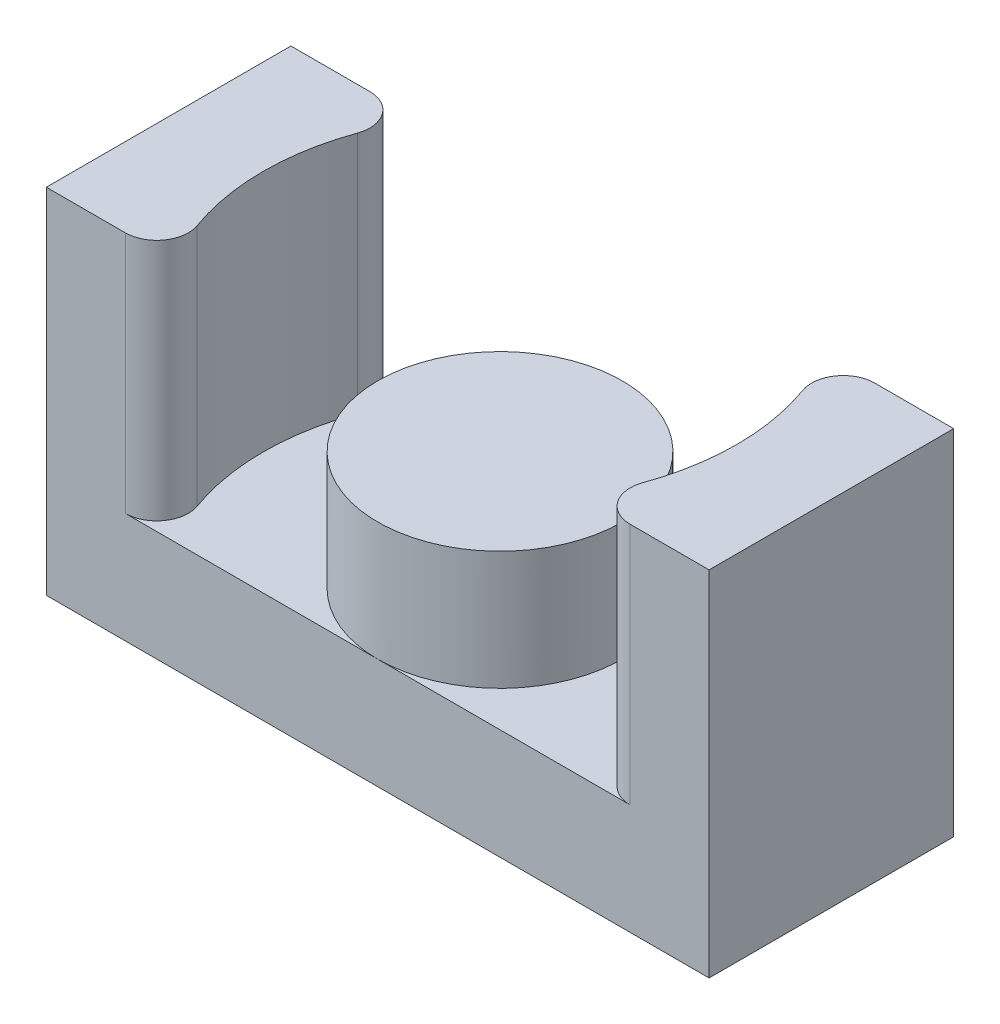
ISO-10303-21;
HEADER;
FILE_DESCRIPTION(('STEP AP214'),'2;1');
FILE_NAME('part.step','',(''),(''),'','','');
FILE_SCHEMA(('AUTOMOTIVE_DESIGN { 1 0 10303 214 1 1 1 1 }'));
ENDSEC;
DATA;
#1=APPLICATION_CONTEXT('core data for automotive mechanical design processes');
#2=APPLICATION_PROTOCOL_DEFINITION('international standard','automotive_design',2000,#1);
#3=PRODUCT_CONTEXT('',#1,'mechanical');
#4=PRODUCT('Part','Part','',(#3));
#5=PRODUCT_RELATED_PRODUCT_CATEGORY('part','',(#4));
#6=PRODUCT_DEFINITION_FORMATION('','',#4);
#7=PRODUCT_DEFINITION_CONTEXT('part definition',#1,'design');
#8=PRODUCT_DEFINITION('design','',#6,#7);
#9=PRODUCT_DEFINITION_SHAPE('','',#8);
#10=(LENGTH_UNIT() NAMED_UNIT(*) SI_UNIT(.MILLI.,.METRE.));
#11=(NAMED_UNIT(*) PLANE_ANGLE_UNIT() SI_UNIT($,.RADIAN.));
#12=(NAMED_UNIT(*) SI_UNIT($,.STERADIAN.) SOLID_ANGLE_UNIT());
#13=UNCERTAINTY_MEASURE_WITH_UNIT(LENGTH_MEASURE(1.E-05),#10,'distance_accuracy_value','');
#14=(GEOMETRIC_REPRESENTATION_CONTEXT(3) GLOBAL_UNCERTAINTY_ASSIGNED_CONTEXT((#13)) GLOBAL_UNIT_ASSIGNED_CONTEXT((#10,
#11,#12)) REPRESENTATION_CONTEXT('',''));
#15=CARTESIAN_POINT('',(0.,0.,0.));
#16=DIRECTION('',(0.,0.,1.));
#17=DIRECTION('',(1.,0.,0.));
#18=AXIS2_PLACEMENT_3D('',#15,#16,#17);
#19=CARTESIAN_POINT('',(0.,14.525,0.));
#20=DIRECTION('',(0.,1.,0.));
#21=DIRECTION('',(-1.,0.,0.));
#22=AXIS2_PLACEMENT_3D('',#19,#20,#21);
#23=PLANE('',#22);
#24=CARTESIAN_POINT('',(0.,14.525,0.));
#25=DIRECTION('',(0.,1.,0.));
#26=DIRECTION('',(-1.,0.,0.));
#27=AXIS2_PLACEMENT_3D('',#24,#25,#26);
#28=CIRCLE('',#27,7.75);
#29=CARTESIAN_POINT('',(-7.75,14.525,0.));
#30=VERTEX_POINT('',#29);
#31=EDGE_CURVE('E20',#30,#30,#28,.F.);
#32=ORIENTED_EDGE('',*,*,#31,.F.);
#33=EDGE_LOOP('',(#32));
#34=FACE_BOUND('',#33,.T.);
#35=ADVANCED_FACE('F17',(#34),#23,.T.);
#36=CARTESIAN_POINT('',(0.,7.,0.));
#37=DIRECTION('',(0.,1.,0.));
#38=DIRECTION('',(-1.,0.,0.));
#39=AXIS2_PLACEMENT_3D('',#36,#37,#38);
#40=CYLINDRICAL_SURFACE('',#39,15.);
#41=DIRECTION('',(0.,1.,0.));
#42=VECTOR('',#41,1.);
#43=CARTESIAN_POINT('',(-14.1159236080378,6.99999999999997,5.0735294117647));
#44=LINE('',#43,#42);
#45=CARTESIAN_POINT('',(-14.1159236080378,6.99999999999998,5.0735294117647));
#46=VERTEX_POINT('',#45);
#47=CARTESIAN_POINT('',(-14.1159236080378,22.4,5.0735294117647));
#48=VERTEX_POINT('',#47);
#49=EDGE_CURVE('E113',#46,#48,#44,.T.);
#50=ORIENTED_EDGE('',*,*,#49,.F.);
#51=CARTESIAN_POINT('',(0.,6.99999999999998,0.));
#52=DIRECTION('',(0.,1.,0.));
#53=DIRECTION('',(-1.,0.,0.));
#54=AXIS2_PLACEMENT_3D('',#51,#52,#53);
#55=CIRCLE('',#54,15.);
#56=CARTESIAN_POINT('',(-14.1159236080379,6.99999999999998,-5.07352941176468));
#57=VERTEX_POINT('',#56);
#58=EDGE_CURVE('E110',#57,#46,#55,.T.);
#59=ORIENTED_EDGE('',*,*,#58,.F.);
#60=DIRECTION('',(0.,1.,0.));
#61=VECTOR('',#60,1.);
#62=CARTESIAN_POINT('',(-14.115923608038,6.99999999999998,-5.0735294117647));
#63=LINE('',#62,#61);
#64=CARTESIAN_POINT('',(-14.115923608038,22.4,-5.07352941176471));
#65=VERTEX_POINT('',#64);
#66=EDGE_CURVE('E140',#65,#57,#63,.F.);
#67=ORIENTED_EDGE('',*,*,#66,.F.);
#68=CARTESIAN_POINT('',(0.,22.4,0.));
#69=DIRECTION('',(0.,1.,0.));
#70=DIRECTION('',(-1.,0.,0.));
#71=AXIS2_PLACEMENT_3D('',#68,#69,#70);
#72=CIRCLE('',#71,15.);
#73=EDGE_CURVE('E117',#65,#48,#72,.T.);
#74=ORIENTED_EDGE('',*,*,#73,.T.);
#75=EDGE_LOOP('',(#50,#59,#67,#74));
#76=FACE_BOUND('',#75,.T.);
#77=ADVANCED_FACE('F115',(#76),#40,.F.);
#78=CARTESIAN_POINT('',(0.,7.,0.));
#79=DIRECTION('',(0.,1.,0.));
#80=DIRECTION('',(-1.,0.,0.));
#81=AXIS2_PLACEMENT_3D('',#78,#79,#80);
#82=CYLINDRICAL_SURFACE('',#81,7.75);
#83=ORIENTED_EDGE('',*,*,#31,.T.);
#84=EDGE_LOOP('',(#83));
#85=FACE_BOUND('',#84,.T.);
#86=CARTESIAN_POINT('',(0.,7.,0.));
#87=DIRECTION('',(0.,1.,0.));
#88=DIRECTION('',(-1.,0.,0.));
#89=AXIS2_PLACEMENT_3D('',#86,#87,#88);
#90=CIRCLE('',#89,7.75);
#91=CARTESIAN_POINT('',(-1.02538915338135E-13,7.,-7.75000000000003));
#92=VERTEX_POINT('',#91);
#93=CARTESIAN_POINT('',(0.,6.99999999999999,7.75000000000003));
#94=VERTEX_POINT('',#93);
#95=EDGE_CURVE('E157',#92,#94,#90,.F.);
#96=ORIENTED_EDGE('',*,*,#95,.F.);
#97=CARTESIAN_POINT('',(0.,7.,0.));
#98=DIRECTION('',(0.,1.,0.));
#99=DIRECTION('',(-1.,0.,0.));
#100=AXIS2_PLACEMENT_3D('',#97,#98,#99);
#101=CIRCLE('',#100,7.75);
#102=EDGE_CURVE('E130',#94,#92,#101,.F.);
#103=ORIENTED_EDGE('',*,*,#102,.F.);
#104=EDGE_LOOP('',(#96,#103));
#105=FACE_BOUND('',#104,.T.);
#106=ADVANCED_FACE('F287',(#85,#105),#82,.T.);
#107=CARTESIAN_POINT('',(0.,7.,0.));
#108=DIRECTION('',(0.,1.,0.));
#109=DIRECTION('',(-1.,0.,0.));
#110=AXIS2_PLACEMENT_3D('',#107,#108,#109);
#111=CYLINDRICAL_SURFACE('',#110,15.);
#112=DIRECTION('',(0.,1.,0.));
#113=VECTOR('',#112,1.);
#114=CARTESIAN_POINT('',(14.1159236080378,6.99999999999995,5.0735294117647));
#115=LINE('',#114,#113);
#116=CARTESIAN_POINT('',(14.1159236080378,22.4,5.0735294117647));
#117=VERTEX_POINT('',#116);
#118=CARTESIAN_POINT('',(14.1159236080378,6.99999999999995,5.0735294117647));
#119=VERTEX_POINT('',#118);
#120=EDGE_CURVE('E120',#117,#119,#115,.F.);
#121=ORIENTED_EDGE('',*,*,#120,.F.);
#122=CARTESIAN_POINT('',(0.,22.4,0.));
#123=DIRECTION('',(0.,1.,0.));
#124=DIRECTION('',(-1.,0.,0.));
#125=AXIS2_PLACEMENT_3D('',#122,#123,#124);
#126=CIRCLE('',#125,15.);
#127=CARTESIAN_POINT('',(14.1159236080377,22.4,-5.07352941176475));
#128=VERTEX_POINT('',#127);
#129=EDGE_CURVE('E151',#117,#128,#126,.T.);
#130=ORIENTED_EDGE('',*,*,#129,.T.);
#131=DIRECTION('',(0.,1.,0.));
#132=VECTOR('',#131,1.);
#133=CARTESIAN_POINT('',(14.1159236080376,6.99999999999996,-5.07352941176473));
#134=LINE('',#133,#132);
#135=CARTESIAN_POINT('',(14.1159236080376,6.99999999999996,-5.07352941176472));
#136=VERTEX_POINT('',#135);
#137=EDGE_CURVE('E153',#136,#128,#134,.T.);
#138=ORIENTED_EDGE('',*,*,#137,.F.);
#139=CARTESIAN_POINT('',(0.,6.99999999999995,0.));
#140=DIRECTION('',(0.,1.,0.));
#141=DIRECTION('',(-1.,0.,0.));
#142=AXIS2_PLACEMENT_3D('',#139,#140,#141);
#143=CIRCLE('',#142,15.);
#144=EDGE_CURVE('E163',#119,#136,#143,.T.);
#145=ORIENTED_EDGE('',*,*,#144,.F.);
#146=EDGE_LOOP('',(#121,#130,#138,#145));
#147=FACE_BOUND('',#146,.T.);
#148=ADVANCED_FACE('F285',(#147),#111,.F.);
#149=CARTESIAN_POINT('',(-15.9980467557762,6.99999999999997,5.75000000000001));
#150=DIRECTION('',(0.,1.,0.));
#151=DIRECTION('',(-1.,0.,0.));
#152=AXIS2_PLACEMENT_3D('',#149,#150,#151);
#153=CYLINDRICAL_SURFACE('',#152,2.);
#154=CARTESIAN_POINT('',(-15.9980467557762,22.4,5.75000000000001));
#155=DIRECTION('',(0.,1.,0.));
#156=DIRECTION('',(-1.,0.,0.));
#157=AXIS2_PLACEMENT_3D('',#154,#155,#156);
#158=CIRCLE('',#157,2.);
#159=CARTESIAN_POINT('',(-15.9980467557762,22.4,7.75000000000006));
#160=VERTEX_POINT('',#159);
#161=EDGE_CURVE('E146',#48,#160,#158,.F.);
#162=ORIENTED_EDGE('',*,*,#161,.T.);
#163=DIRECTION('',(0.,1.,0.));
#164=VECTOR('',#163,1.);
#165=CARTESIAN_POINT('',(-15.9980467557762,22.4,7.75000000000006));
#166=LINE('',#165,#164);
#167=CARTESIAN_POINT('',(-15.9980467557762,6.99999999999998,7.75000000000006));
#168=VERTEX_POINT('',#167);
#169=EDGE_CURVE('E126',#160,#168,#166,.F.);
#170=ORIENTED_EDGE('',*,*,#169,.T.);
#171=CARTESIAN_POINT('',(-15.9980467557762,6.99999999999998,5.75000000000001));
#172=DIRECTION('',(0.,1.,0.));
#173=DIRECTION('',(-1.,0.,0.));
#174=AXIS2_PLACEMENT_3D('',#171,#172,#173);
#175=CIRCLE('',#174,2.);
#176=EDGE_CURVE('E123',#46,#168,#175,.F.);
#177=ORIENTED_EDGE('',*,*,#176,.F.);
#178=ORIENTED_EDGE('',*,*,#49,.T.);
#179=EDGE_LOOP('',(#162,#170,#177,#178));
#180=FACE_BOUND('',#179,.T.);
#181=ADVANCED_FACE('F124',(#180),#153,.T.);
#182=CARTESIAN_POINT('',(15.9980467557762,6.99999999999995,5.75));
#183=DIRECTION('',(0.,1.,0.));
#184=DIRECTION('',(-1.,0.,0.));
#185=AXIS2_PLACEMENT_3D('',#182,#183,#184);
#186=CYLINDRICAL_SURFACE('',#185,2.);
#187=CARTESIAN_POINT('',(15.9980467557762,6.99999999999995,5.75));
#188=DIRECTION('',(0.,1.,0.));
#189=DIRECTION('',(-1.,0.,0.));
#190=AXIS2_PLACEMENT_3D('',#187,#188,#189);
#191=CIRCLE('',#190,2.);
#192=CARTESIAN_POINT('',(15.9980467557762,6.99999999999997,7.75000000000006));
#193=VERTEX_POINT('',#192);
#194=EDGE_CURVE('E160',#193,#119,#191,.F.);
#195=ORIENTED_EDGE('',*,*,#194,.F.);
#196=DIRECTION('',(0.,1.,0.));
#197=VECTOR('',#196,1.);
#198=CARTESIAN_POINT('',(15.9980467557762,22.4,7.75000000000006));
#199=LINE('',#198,#197);
#200=CARTESIAN_POINT('',(15.9980467557762,22.4,7.75000000000006));
#201=VERTEX_POINT('',#200);
#202=EDGE_CURVE('E186',#193,#201,#199,.T.);
#203=ORIENTED_EDGE('',*,*,#202,.T.);
#204=CARTESIAN_POINT('',(15.9980467557762,22.4,5.75));
#205=DIRECTION('',(0.,1.,0.));
#206=DIRECTION('',(-1.,0.,0.));
#207=AXIS2_PLACEMENT_3D('',#204,#205,#206);
#208=CIRCLE('',#207,2.);
#209=EDGE_CURVE('E148',#201,#117,#208,.F.);
#210=ORIENTED_EDGE('',*,*,#209,.T.);
#211=ORIENTED_EDGE('',*,*,#120,.T.);
#212=EDGE_LOOP('',(#195,#203,#210,#211));
#213=FACE_BOUND('',#212,.T.);
#214=ADVANCED_FACE('F275',(#213),#186,.T.);
#215=CARTESIAN_POINT('',(0.,7.,0.));
#216=DIRECTION('',(0.,1.,0.));
#217=DIRECTION('',(-1.,0.,0.));
#218=AXIS2_PLACEMENT_3D('',#215,#216,#217);
#219=PLANE('',#218);
#220=DIRECTION('',(-1.,0.,0.));
#221=VECTOR('',#220,1.);
#222=CARTESIAN_POINT('',(-21.,6.99999999999998,7.75000000000006));
#223=LINE('',#222,#221);
#224=EDGE_CURVE('E180',#168,#94,#223,.F.);
#225=ORIENTED_EDGE('',*,*,#224,.T.);
#226=ORIENTED_EDGE('',*,*,#102,.T.);
#227=DIRECTION('',(1.,0.,0.));
#228=VECTOR('',#227,1.);
#229=CARTESIAN_POINT('',(-21.0000000000002,7.,-7.75000000000007));
#230=LINE('',#229,#228);
#231=CARTESIAN_POINT('',(-15.9980467557764,6.99999999999999,-7.75000000000007));
#232=VERTEX_POINT('',#231);
#233=EDGE_CURVE('E202',#92,#232,#230,.F.);
#234=ORIENTED_EDGE('',*,*,#233,.T.);
#235=CARTESIAN_POINT('',(-15.9980467557764,6.99999999999998,-5.75000000000001));
#236=DIRECTION('',(0.,1.,0.));
#237=DIRECTION('',(-1.,0.,0.));
#238=AXIS2_PLACEMENT_3D('',#235,#236,#237);
#239=CIRCLE('',#238,2.);
#240=EDGE_CURVE('E134',#57,#232,#239,.T.);
#241=ORIENTED_EDGE('',*,*,#240,.F.);
#242=ORIENTED_EDGE('',*,*,#58,.T.);
#243=ORIENTED_EDGE('',*,*,#176,.T.);
#244=EDGE_LOOP('',(#225,#226,#234,#241,#242,#243));
#245=FACE_BOUND('',#244,.T.);
#246=ADVANCED_FACE('F132',(#245),#219,.T.);
#247=CARTESIAN_POINT('',(-15.9980467557764,6.99999999999998,-5.75000000000001));
#248=DIRECTION('',(0.,1.,0.));
#249=DIRECTION('',(-1.,0.,0.));
#250=AXIS2_PLACEMENT_3D('',#247,#248,#249);
#251=CYLINDRICAL_SURFACE('',#250,2.);
#252=ORIENTED_EDGE('',*,*,#240,.T.);
#253=DIRECTION('',(0.,1.,0.));
#254=VECTOR('',#253,1.);
#255=CARTESIAN_POINT('',(-15.9980467557764,22.4,-7.75000000000007));
#256=LINE('',#255,#254);
#257=CARTESIAN_POINT('',(-15.9980467557764,22.4,-7.75000000000007));
#258=VERTEX_POINT('',#257);
#259=EDGE_CURVE('E218',#232,#258,#256,.T.);
#260=ORIENTED_EDGE('',*,*,#259,.T.);
#261=CARTESIAN_POINT('',(-15.9980467557764,22.4,-5.75000000000001));
#262=DIRECTION('',(0.,1.,0.));
#263=DIRECTION('',(-1.,0.,0.));
#264=AXIS2_PLACEMENT_3D('',#261,#262,#263);
#265=CIRCLE('',#264,2.);
#266=EDGE_CURVE('E142',#258,#65,#265,.F.);
#267=ORIENTED_EDGE('',*,*,#266,.T.);
#268=ORIENTED_EDGE('',*,*,#66,.T.);
#269=EDGE_LOOP('',(#252,#260,#267,#268));
#270=FACE_BOUND('',#269,.T.);
#271=ADVANCED_FACE('F318',(#270),#251,.T.);
#272=CARTESIAN_POINT('',(20.9999999999998,22.4,-7.74999999999998));
#273=DIRECTION('',(0.,-1.,0.));
#274=DIRECTION('',(1.,0.,0.));
#275=AXIS2_PLACEMENT_3D('',#272,#273,#274);
#276=PLANE('',#275);
#277=ORIENTED_EDGE('',*,*,#161,.F.);
#278=ORIENTED_EDGE('',*,*,#73,.F.);
#279=ORIENTED_EDGE('',*,*,#266,.F.);
#280=DIRECTION('',(1.,0.,0.));
#281=VECTOR('',#280,1.);
#282=CARTESIAN_POINT('',(-21.0000000000002,22.4,-7.75000000000007));
#283=LINE('',#282,#281);
#284=CARTESIAN_POINT('',(-21.0000000000001,22.4,-7.75000000000007));
#285=VERTEX_POINT('',#284);
#286=EDGE_CURVE('E211',#258,#285,#283,.F.);
#287=ORIENTED_EDGE('',*,*,#286,.T.);
#288=DIRECTION('',(0.,0.,1.));
#289=VECTOR('',#288,1.);
#290=CARTESIAN_POINT('',(-21.,22.4,7.75000000000006));
#291=LINE('',#290,#289);
#292=CARTESIAN_POINT('',(-21.,22.4,7.75000000000006));
#293=VERTEX_POINT('',#292);
#294=EDGE_CURVE('E196',#285,#293,#291,.T.);
#295=ORIENTED_EDGE('',*,*,#294,.T.);
#296=DIRECTION('',(-1.,0.,0.));
#297=VECTOR('',#296,1.);
#298=CARTESIAN_POINT('',(-21.,22.4,7.75000000000006));
#299=LINE('',#298,#297);
#300=EDGE_CURVE('E181',#293,#160,#299,.F.);
#301=ORIENTED_EDGE('',*,*,#300,.T.);
#302=EDGE_LOOP('',(#277,#278,#279,#287,#295,#301));
#303=FACE_BOUND('',#302,.T.);
#304=ADVANCED_FACE('F255',(#303),#276,.F.);
#305=CARTESIAN_POINT('',(20.9999999999998,22.4,-7.74999999999998));
#306=DIRECTION('',(0.,-1.,0.));
#307=DIRECTION('',(1.,0.,0.));
#308=AXIS2_PLACEMENT_3D('',#305,#306,#307);
#309=PLANE('',#308);
#310=ORIENTED_EDGE('',*,*,#209,.F.);
#311=DIRECTION('',(-1.,0.,0.));
#312=VECTOR('',#311,1.);
#313=CARTESIAN_POINT('',(-21.,22.4,7.75000000000006));
#314=LINE('',#313,#312);
#315=CARTESIAN_POINT('',(21.,22.4,7.75000000000004));
#316=VERTEX_POINT('',#315);
#317=EDGE_CURVE('E193',#201,#316,#314,.F.);
#318=ORIENTED_EDGE('',*,*,#317,.T.);
#319=DIRECTION('',(0.,0.,1.));
#320=VECTOR('',#319,1.);
#321=CARTESIAN_POINT('',(21.,22.4,7.75000000000001));
#322=LINE('',#321,#320);
#323=CARTESIAN_POINT('',(20.9999999999999,22.4,-7.75000000000004));
#324=VERTEX_POINT('',#323);
#325=EDGE_CURVE('E169',#316,#324,#322,.F.);
#326=ORIENTED_EDGE('',*,*,#325,.T.);
#327=DIRECTION('',(1.,0.,0.));
#328=VECTOR('',#327,1.);
#329=CARTESIAN_POINT('',(-21.0000000000002,22.4,-7.75000000000007));
#330=LINE('',#329,#328);
#331=CARTESIAN_POINT('',(15.9980467557759,22.4,-7.75000000000007));
#332=VERTEX_POINT('',#331);
#333=EDGE_CURVE('E234',#324,#332,#330,.F.);
#334=ORIENTED_EDGE('',*,*,#333,.T.);
#335=CARTESIAN_POINT('',(15.9980467557759,22.4,-5.75000000000001));
#336=DIRECTION('',(0.,1.,0.));
#337=DIRECTION('',(-1.,0.,0.));
#338=AXIS2_PLACEMENT_3D('',#335,#336,#337);
#339=CIRCLE('',#338,2.);
#340=EDGE_CURVE('E154',#128,#332,#339,.F.);
#341=ORIENTED_EDGE('',*,*,#340,.F.);
#342=ORIENTED_EDGE('',*,*,#129,.F.);
#343=EDGE_LOOP('',(#310,#318,#326,#334,#341,#342));
#344=FACE_BOUND('',#343,.T.);
#345=ADVANCED_FACE('F271',(#344),#309,.F.);
#346=CARTESIAN_POINT('',(15.9980467557759,6.99999999999996,-5.75000000000001));
#347=DIRECTION('',(0.,1.,0.));
#348=DIRECTION('',(-1.,0.,0.));
#349=AXIS2_PLACEMENT_3D('',#346,#347,#348);
#350=CYLINDRICAL_SURFACE('',#349,2.);
#351=ORIENTED_EDGE('',*,*,#340,.T.);
#352=DIRECTION('',(0.,1.,0.));
#353=VECTOR('',#352,1.);
#354=CARTESIAN_POINT('',(15.9980467557759,22.4,-7.75000000000007));
#355=LINE('',#354,#353);
#356=CARTESIAN_POINT('',(15.9980467557759,6.99999999999998,-7.75000000000007));
#357=VERTEX_POINT('',#356);
#358=EDGE_CURVE('E238',#332,#357,#355,.F.);
#359=ORIENTED_EDGE('',*,*,#358,.T.);
#360=CARTESIAN_POINT('',(15.9980467557759,6.99999999999998,-5.75000000000001));
#361=DIRECTION('',(0.,1.,0.));
#362=DIRECTION('',(-1.,0.,0.));
#363=AXIS2_PLACEMENT_3D('',#360,#361,#362);
#364=CIRCLE('',#363,2.);
#365=EDGE_CURVE('E166',#136,#357,#364,.F.);
#366=ORIENTED_EDGE('',*,*,#365,.F.);
#367=ORIENTED_EDGE('',*,*,#137,.T.);
#368=EDGE_LOOP('',(#351,#359,#366,#367));
#369=FACE_BOUND('',#368,.T.);
#370=ADVANCED_FACE('F283',(#369),#350,.T.);
#371=CARTESIAN_POINT('',(0.,7.,0.));
#372=DIRECTION('',(0.,1.,0.));
#373=DIRECTION('',(-1.,0.,0.));
#374=AXIS2_PLACEMENT_3D('',#371,#372,#373);
#375=PLANE('',#374);
#376=ORIENTED_EDGE('',*,*,#144,.T.);
#377=ORIENTED_EDGE('',*,*,#365,.T.);
#378=DIRECTION('',(1.,0.,0.));
#379=VECTOR('',#378,1.);
#380=CARTESIAN_POINT('',(-21.0000000000002,6.99999999999998,-7.75000000000007));
#381=LINE('',#380,#379);
#382=EDGE_CURVE('E226',#357,#92,#381,.F.);
#383=ORIENTED_EDGE('',*,*,#382,.T.);
#384=ORIENTED_EDGE('',*,*,#95,.T.);
#385=DIRECTION('',(-1.,0.,0.));
#386=VECTOR('',#385,1.);
#387=CARTESIAN_POINT('',(-21.,7.,7.75000000000006));
#388=LINE('',#387,#386);
#389=EDGE_CURVE('E183',#94,#193,#388,.F.);
#390=ORIENTED_EDGE('',*,*,#389,.T.);
#391=ORIENTED_EDGE('',*,*,#194,.T.);
#392=EDGE_LOOP('',(#376,#377,#383,#384,#390,#391));
#393=FACE_BOUND('',#392,.T.);
#394=ADVANCED_FACE('F278',(#393),#375,.T.);
#395=CARTESIAN_POINT('',(21.,22.4,7.75000000000001));
#396=DIRECTION('',(-1.,0.,0.));
#397=DIRECTION('',(0.,-1.,0.));
#398=AXIS2_PLACEMENT_3D('',#395,#396,#397);
#399=PLANE('',#398);
#400=DIRECTION('',(0.,1.,0.));
#401=VECTOR('',#400,1.);
#402=CARTESIAN_POINT('',(20.9999999999998,22.4,-7.75000000000007));
#403=LINE('',#402,#401);
#404=CARTESIAN_POINT('',(20.9999999999998,0.,-7.75000000000007));
#405=VERTEX_POINT('',#404);
#406=EDGE_CURVE('E210',#405,#324,#403,.T.);
#407=ORIENTED_EDGE('',*,*,#406,.T.);
#408=ORIENTED_EDGE('',*,*,#325,.F.);
#409=DIRECTION('',(0.,1.,0.));
#410=VECTOR('',#409,1.);
#411=CARTESIAN_POINT('',(21.,22.4,7.75000000000006));
#412=LINE('',#411,#410);
#413=CARTESIAN_POINT('',(20.9999999999999,0.,7.75000000000004));
#414=VERTEX_POINT('',#413);
#415=EDGE_CURVE('E189',#316,#414,#412,.F.);
#416=ORIENTED_EDGE('',*,*,#415,.T.);
#417=DIRECTION('',(0.,0.,1.));
#418=VECTOR('',#417,1.);
#419=CARTESIAN_POINT('',(20.9999999999998,0.,-7.74999999999998));
#420=LINE('',#419,#418);
#421=EDGE_CURVE('E178',#405,#414,#420,.T.);
#422=ORIENTED_EDGE('',*,*,#421,.F.);
#423=EDGE_LOOP('',(#407,#408,#416,#422));
#424=FACE_BOUND('',#423,.T.);
#425=ADVANCED_FACE('F266',(#424),#399,.F.);
#426=CARTESIAN_POINT('',(-21.,22.4,7.75000000000006));
#427=DIRECTION('',(0.,0.,-1.));
#428=DIRECTION('',(-1.,0.,0.));
#429=AXIS2_PLACEMENT_3D('',#426,#427,#428);
#430=PLANE('',#429);
#431=ORIENTED_EDGE('',*,*,#202,.F.);
#432=ORIENTED_EDGE('',*,*,#389,.F.);
#433=ORIENTED_EDGE('',*,*,#224,.F.);
#434=ORIENTED_EDGE('',*,*,#169,.F.);
#435=ORIENTED_EDGE('',*,*,#300,.F.);
#436=DIRECTION('',(0.,1.,0.));
#437=VECTOR('',#436,1.);
#438=CARTESIAN_POINT('',(-21.,22.4,7.75000000000006));
#439=LINE('',#438,#437);
#440=CARTESIAN_POINT('',(-21.,0.,7.75000000000004));
#441=VERTEX_POINT('',#440);
#442=EDGE_CURVE('E200',#293,#441,#439,.F.);
#443=ORIENTED_EDGE('',*,*,#442,.T.);
#444=DIRECTION('',(1.,0.,0.));
#445=VECTOR('',#444,1.);
#446=CARTESIAN_POINT('',(20.9999999999998,0.,7.75000000000001));
#447=LINE('',#446,#445);
#448=EDGE_CURVE('E175',#414,#441,#447,.F.);
#449=ORIENTED_EDGE('',*,*,#448,.F.);
#450=ORIENTED_EDGE('',*,*,#415,.F.);
#451=ORIENTED_EDGE('',*,*,#317,.F.);
#452=EDGE_LOOP('',(#431,#432,#433,#434,#435,#443,#449,#450,#451));
#453=FACE_BOUND('',#452,.T.);
#454=ADVANCED_FACE('F252',(#453),#430,.F.);
#455=CARTESIAN_POINT('',(-21.,22.4,7.75000000000006));
#456=DIRECTION('',(1.,0.,0.));
#457=DIRECTION('',(0.,1.,0.));
#458=AXIS2_PLACEMENT_3D('',#455,#456,#457);
#459=PLANE('',#458);
#460=ORIENTED_EDGE('',*,*,#442,.F.);
#461=ORIENTED_EDGE('',*,*,#294,.F.);
#462=DIRECTION('',(0.,1.,0.));
#463=VECTOR('',#462,1.);
#464=CARTESIAN_POINT('',(-21.0000000000002,22.4,-7.75000000000007));
#465=LINE('',#464,#463);
#466=CARTESIAN_POINT('',(-21.0000000000001,0.,-7.75000000000006));
#467=VERTEX_POINT('',#466);
#468=EDGE_CURVE('E35',#285,#467,#465,.F.);
#469=ORIENTED_EDGE('',*,*,#468,.T.);
#470=DIRECTION('',(0.,0.,1.));
#471=VECTOR('',#470,1.);
#472=CARTESIAN_POINT('',(-21.,0.,-7.74999999999998));
#473=LINE('',#472,#471);
#474=EDGE_CURVE('E26',#441,#467,#473,.F.);
#475=ORIENTED_EDGE('',*,*,#474,.F.);
#476=EDGE_LOOP('',(#460,#461,#469,#475));
#477=FACE_BOUND('',#476,.T.);
#478=ADVANCED_FACE('F248',(#477),#459,.F.);
#479=CARTESIAN_POINT('',(-21.0000000000002,22.4,-7.75000000000007));
#480=DIRECTION('',(0.,0.,1.));
#481=DIRECTION('',(1.,0.,0.));
#482=AXIS2_PLACEMENT_3D('',#479,#480,#481);
#483=PLANE('',#482);
#484=ORIENTED_EDGE('',*,*,#358,.F.);
#485=ORIENTED_EDGE('',*,*,#333,.F.);
#486=ORIENTED_EDGE('',*,*,#406,.F.);
#487=DIRECTION('',(1.,0.,0.));
#488=VECTOR('',#487,1.);
#489=CARTESIAN_POINT('',(20.9999999999998,0.,-7.75000000000006));
#490=LINE('',#489,#488);
#491=EDGE_CURVE('E11',#467,#405,#490,.T.);
#492=ORIENTED_EDGE('',*,*,#491,.F.);
#493=ORIENTED_EDGE('',*,*,#468,.F.);
#494=ORIENTED_EDGE('',*,*,#286,.F.);
#495=ORIENTED_EDGE('',*,*,#259,.F.);
#496=ORIENTED_EDGE('',*,*,#233,.F.);
#497=ORIENTED_EDGE('',*,*,#382,.F.);
#498=EDGE_LOOP('',(#484,#485,#486,#492,#493,#494,#495,#496,#497));
#499=FACE_BOUND('',#498,.T.);
#500=ADVANCED_FACE('F261',(#499),#483,.F.);
#501=CARTESIAN_POINT('',(20.9999999999998,0.,-7.74999999999998));
#502=DIRECTION('',(0.,-1.,0.));
#503=DIRECTION('',(1.,0.,0.));
#504=AXIS2_PLACEMENT_3D('',#501,#502,#503);
#505=PLANE('',#504);
#506=ORIENTED_EDGE('',*,*,#474,.T.);
#507=ORIENTED_EDGE('',*,*,#491,.T.);
#508=ORIENTED_EDGE('',*,*,#421,.T.);
#509=ORIENTED_EDGE('',*,*,#448,.T.);
#510=EDGE_LOOP('',(#506,#507,#508,#509));
#511=FACE_BOUND('',#510,.T.);
#512=ADVANCED_FACE('F245',(#511),#505,.T.);
#513=CLOSED_SHELL('',(#35,#77,#106,#148,#181,#214,#246,#271,#304,#345,#370,#394,#425,#454,#478,
#500,#512));
#514=MANIFOLD_SOLID_BREP('B1',#513);
#515=ADVANCED_BREP_SHAPE_REPRESENTATION('',(#18,#514),#14);
#516=SHAPE_DEFINITION_REPRESENTATION(#9,#515);
ENDSEC;
END-ISO-10303-21;
